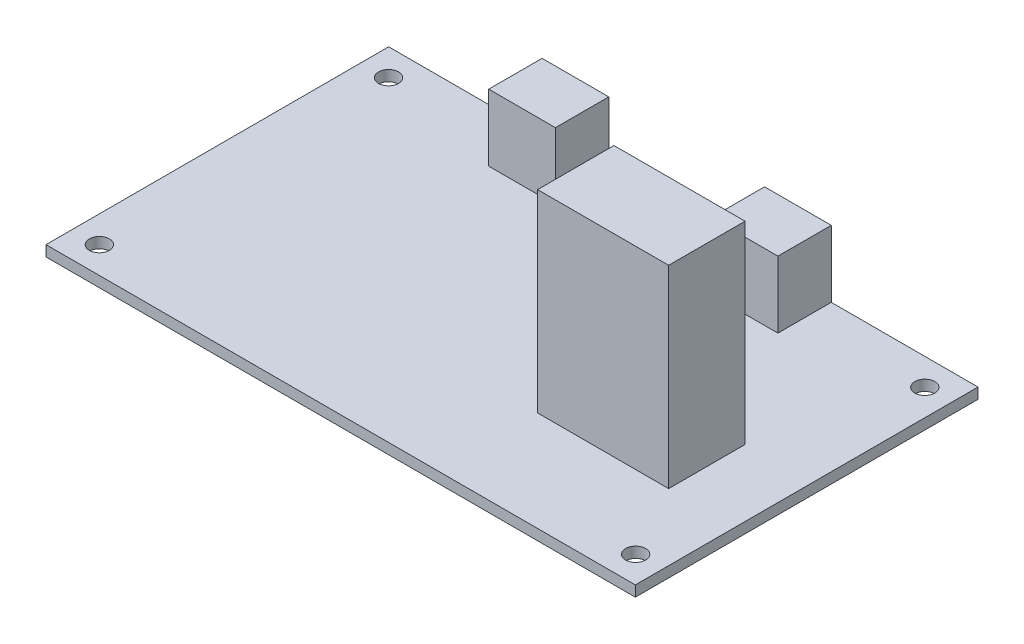
ISO-10303-21;
HEADER;
FILE_DESCRIPTION(('STEP AP214'),'2;1');
FILE_NAME('part.step','',(''),(''),'','','');
FILE_SCHEMA(('AUTOMOTIVE_DESIGN { 1 0 10303 214 1 1 1 1 }'));
ENDSEC;
DATA;
#1=APPLICATION_CONTEXT('core data for automotive mechanical design processes');
#2=APPLICATION_PROTOCOL_DEFINITION('international standard','automotive_design',2000,#1);
#3=PRODUCT_CONTEXT('',#1,'mechanical');
#4=PRODUCT('Part','Part','',(#3));
#5=PRODUCT_RELATED_PRODUCT_CATEGORY('part','',(#4));
#6=PRODUCT_DEFINITION_FORMATION('','',#4);
#7=PRODUCT_DEFINITION_CONTEXT('part definition',#1,'design');
#8=PRODUCT_DEFINITION('design','',#6,#7);
#9=PRODUCT_DEFINITION_SHAPE('','',#8);
#10=(LENGTH_UNIT() NAMED_UNIT(*) SI_UNIT(.MILLI.,.METRE.));
#11=(NAMED_UNIT(*) PLANE_ANGLE_UNIT() SI_UNIT($,.RADIAN.));
#12=(NAMED_UNIT(*) SI_UNIT($,.STERADIAN.) SOLID_ANGLE_UNIT());
#13=UNCERTAINTY_MEASURE_WITH_UNIT(LENGTH_MEASURE(1.E-05),#10,'distance_accuracy_value','');
#14=(GEOMETRIC_REPRESENTATION_CONTEXT(3) GLOBAL_UNCERTAINTY_ASSIGNED_CONTEXT((#13)) GLOBAL_UNIT_ASSIGNED_CONTEXT((#10,
#11,#12)) REPRESENTATION_CONTEXT('',''));
#15=CARTESIAN_POINT('',(0.,0.,0.));
#16=DIRECTION('',(0.,0.,1.));
#17=DIRECTION('',(1.,0.,0.));
#18=AXIS2_PLACEMENT_3D('',#15,#16,#17);
#19=CARTESIAN_POINT('',(0.,1.6,0.));
#20=DIRECTION('',(0.,1.,0.));
#21=DIRECTION('',(0.,0.,1.));
#22=AXIS2_PLACEMENT_3D('',#19,#20,#21);
#23=PLANE('',#22);
#24=CARTESIAN_POINT('',(-27.2380952380953,1.6,-27.5504761904762));
#25=DIRECTION('',(0.,1.,0.));
#26=DIRECTION('',(0.,0.,1.));
#27=AXIS2_PLACEMENT_3D('',#24,#25,#26);
#28=CIRCLE('',#27,1.5);
#29=CARTESIAN_POINT('',(-27.2380952380953,1.6,-26.0504761904762));
#30=VERTEX_POINT('',#29);
#31=EDGE_CURVE('E303',#30,#30,#28,.T.);
#32=ORIENTED_EDGE('',*,*,#31,.F.);
#33=EDGE_LOOP('',(#32));
#34=FACE_BOUND('',#33,.T.);
#35=CARTESIAN_POINT('',(53.1719047619048,1.6,15.8095238095238));
#36=DIRECTION('',(0.,1.,0.));
#37=DIRECTION('',(0.,0.,1.));
#38=AXIS2_PLACEMENT_3D('',#35,#36,#37);
#39=CIRCLE('',#38,1.5);
#40=CARTESIAN_POINT('',(53.1719047619048,1.6,17.3095238095238));
#41=VERTEX_POINT('',#40);
#42=EDGE_CURVE('E315',#41,#41,#39,.T.);
#43=ORIENTED_EDGE('',*,*,#42,.F.);
#44=EDGE_LOOP('',(#43));
#45=FACE_BOUND('',#44,.T.);
#46=CARTESIAN_POINT('',(53.1719047619047,1.6,-27.5504761904762));
#47=DIRECTION('',(0.,1.,0.));
#48=DIRECTION('',(0.,0.,1.));
#49=AXIS2_PLACEMENT_3D('',#46,#47,#48);
#50=CIRCLE('',#49,1.5);
#51=CARTESIAN_POINT('',(53.1719047619047,1.6,-26.0504761904762));
#52=VERTEX_POINT('',#51);
#53=EDGE_CURVE('E309',#52,#52,#50,.T.);
#54=ORIENTED_EDGE('',*,*,#53,.F.);
#55=EDGE_LOOP('',(#54));
#56=FACE_BOUND('',#55,.T.);
#57=CARTESIAN_POINT('',(-27.2380952380952,1.6,15.8095238095238));
#58=DIRECTION('',(0.,1.,0.));
#59=DIRECTION('',(0.,0.,1.));
#60=AXIS2_PLACEMENT_3D('',#57,#58,#59);
#61=CIRCLE('',#60,1.5);
#62=CARTESIAN_POINT('',(-27.2380952380952,1.6,17.3095238095238));
#63=VERTEX_POINT('',#62);
#64=EDGE_CURVE('E297',#63,#63,#61,.T.);
#65=ORIENTED_EDGE('',*,*,#64,.F.);
#66=EDGE_LOOP('',(#65));
#67=FACE_BOUND('',#66,.T.);
#68=DIRECTION('',(1.,0.,0.));
#69=VECTOR('',#68,1.);
#70=CARTESIAN_POINT('',(-31.2380952380952,1.6,-31.5704761904758));
#71=LINE('',#70,#69);
#72=CARTESIAN_POINT('',(1.76190476190482,1.6,-31.5704761904758));
#73=VERTEX_POINT('',#72);
#74=CARTESIAN_POINT('',(25.1219047619048,1.6,-31.5704761904758));
#75=VERTEX_POINT('',#74);
#76=EDGE_CURVE('E333',#73,#75,#71,.T.);
#77=ORIENTED_EDGE('',*,*,#76,.F.);
#78=DIRECTION('',(0.,0.,-1.));
#79=VECTOR('',#78,1.);
#80=CARTESIAN_POINT('',(1.76190476190482,1.6,-31.5704761904758));
#81=LINE('',#80,#79);
#82=CARTESIAN_POINT('',(1.76190476190482,1.6,-23.5704761904758));
#83=VERTEX_POINT('',#82);
#84=EDGE_CURVE('E122',#83,#73,#81,.T.);
#85=ORIENTED_EDGE('',*,*,#84,.F.);
#86=DIRECTION('',(1.,0.,0.));
#87=VECTOR('',#86,1.);
#88=CARTESIAN_POINT('',(1.76190476190482,1.6,-23.5704761904758));
#89=LINE('',#88,#87);
#90=CARTESIAN_POINT('',(-8.23809523809518,1.6,-23.5704761904758));
#91=VERTEX_POINT('',#90);
#92=EDGE_CURVE('E249',#91,#83,#89,.T.);
#93=ORIENTED_EDGE('',*,*,#92,.F.);
#94=DIRECTION('',(0.,0.,1.));
#95=VECTOR('',#94,1.);
#96=CARTESIAN_POINT('',(-8.23809523809518,1.6,-31.5704761904758));
#97=LINE('',#96,#95);
#98=CARTESIAN_POINT('',(-8.23809523809518,1.6,-31.5704761904758));
#99=VERTEX_POINT('',#98);
#100=EDGE_CURVE('E240',#99,#91,#97,.T.);
#101=ORIENTED_EDGE('',*,*,#100,.F.);
#102=CARTESIAN_POINT('',(-31.2380952380952,1.6,-31.5704761904758));
#103=VERTEX_POINT('',#102);
#104=EDGE_CURVE('E329',#103,#99,#71,.T.);
#105=ORIENTED_EDGE('',*,*,#104,.F.);
#106=DIRECTION('',(0.,0.,-1.));
#107=VECTOR('',#106,1.);
#108=CARTESIAN_POINT('',(-31.2380952380952,1.6,19.8095238095238));
#109=LINE('',#108,#107);
#110=CARTESIAN_POINT('',(-31.2380952380952,1.6,19.8095238095238));
#111=VERTEX_POINT('',#110);
#112=EDGE_CURVE('E332',#111,#103,#109,.T.);
#113=ORIENTED_EDGE('',*,*,#112,.F.);
#114=DIRECTION('',(1.,0.,0.));
#115=VECTOR('',#114,1.);
#116=CARTESIAN_POINT('',(-31.2380952380952,1.6,19.8095238095238));
#117=LINE('',#116,#115);
#118=CARTESIAN_POINT('',(57.1219047619048,1.6,19.8095238095238));
#119=VERTEX_POINT('',#118);
#120=EDGE_CURVE('E321',#111,#119,#117,.T.);
#121=ORIENTED_EDGE('',*,*,#120,.T.);
#122=DIRECTION('',(0.,0.,-1.));
#123=VECTOR('',#122,1.);
#124=CARTESIAN_POINT('',(57.1219047619048,1.6,19.8095238095238));
#125=LINE('',#124,#123);
#126=CARTESIAN_POINT('',(57.1219047619048,1.6,-31.5704761904758));
#127=VERTEX_POINT('',#126);
#128=EDGE_CURVE('E324',#119,#127,#125,.T.);
#129=ORIENTED_EDGE('',*,*,#128,.T.);
#130=CARTESIAN_POINT('',(35.1219047619048,1.6,-31.5704761904758));
#131=VERTEX_POINT('',#130);
#132=EDGE_CURVE('E328',#131,#127,#71,.T.);
#133=ORIENTED_EDGE('',*,*,#132,.F.);
#134=DIRECTION('',(0.,0.,-1.));
#135=VECTOR('',#134,1.);
#136=CARTESIAN_POINT('',(35.1219047619048,1.6,-31.5704761904758));
#137=LINE('',#136,#135);
#138=CARTESIAN_POINT('',(35.1219047619048,1.6,-23.5704761904758));
#139=VERTEX_POINT('',#138);
#140=EDGE_CURVE('E266',#139,#131,#137,.T.);
#141=ORIENTED_EDGE('',*,*,#140,.F.);
#142=DIRECTION('',(1.,0.,0.));
#143=VECTOR('',#142,1.);
#144=CARTESIAN_POINT('',(35.1219047619048,1.6,-23.5704761904758));
#145=LINE('',#144,#143);
#146=CARTESIAN_POINT('',(25.1219047619048,1.6,-23.5704761904758));
#147=VERTEX_POINT('',#146);
#148=EDGE_CURVE('E271',#147,#139,#145,.T.);
#149=ORIENTED_EDGE('',*,*,#148,.F.);
#150=DIRECTION('',(0.,0.,1.));
#151=VECTOR('',#150,1.);
#152=CARTESIAN_POINT('',(25.1219047619048,1.6,-31.5704761904758));
#153=LINE('',#152,#151);
#154=EDGE_CURVE('E280',#75,#147,#153,.T.);
#155=ORIENTED_EDGE('',*,*,#154,.F.);
#156=EDGE_LOOP('',(#77,#85,#93,#101,#105,#113,#121,#129,#133,#141,#149,#155));
#157=FACE_BOUND('',#156,.T.);
#158=DIRECTION('',(-1.,0.,0.));
#159=VECTOR('',#158,1.);
#160=CARTESIAN_POINT('',(47.1219047619048,1.6,-6.64163494638696));
#161=LINE('',#160,#159);
#162=CARTESIAN_POINT('',(47.1219047619048,1.6,-6.64163494638696));
#163=VERTEX_POINT('',#162);
#164=CARTESIAN_POINT('',(27.4718200922198,1.6,-6.64163494638695));
#165=VERTEX_POINT('',#164);
#166=EDGE_CURVE('E605',#163,#165,#161,.T.);
#167=ORIENTED_EDGE('',*,*,#166,.F.);
#168=DIRECTION('',(0.,0.,-1.));
#169=VECTOR('',#168,1.);
#170=CARTESIAN_POINT('',(47.1219047619048,1.6,-6.64163494638696));
#171=LINE('',#170,#169);
#172=CARTESIAN_POINT('',(47.1219047619048,1.6,4.80952380952378));
#173=VERTEX_POINT('',#172);
#174=EDGE_CURVE('E237',#173,#163,#171,.T.);
#175=ORIENTED_EDGE('',*,*,#174,.F.);
#176=DIRECTION('',(1.,0.,0.));
#177=VECTOR('',#176,1.);
#178=CARTESIAN_POINT('',(47.1219047619048,1.6,4.80952380952378));
#179=LINE('',#178,#177);
#180=CARTESIAN_POINT('',(27.4718200922198,1.6,4.80952380952378));
#181=VERTEX_POINT('',#180);
#182=EDGE_CURVE('E233',#181,#173,#179,.T.);
#183=ORIENTED_EDGE('',*,*,#182,.F.);
#184=DIRECTION('',(0.,0.,1.));
#185=VECTOR('',#184,1.);
#186=CARTESIAN_POINT('',(27.4718200922198,1.6,-6.64163494638695));
#187=LINE('',#186,#185);
#188=EDGE_CURVE('E602',#165,#181,#187,.T.);
#189=ORIENTED_EDGE('',*,*,#188,.F.);
#190=EDGE_LOOP('',(#167,#175,#183,#189));
#191=FACE_BOUND('',#190,.T.);
#192=ADVANCED_FACE('F99',(#34,#45,#56,#67,#157,#191),#23,.T.);
#193=CARTESIAN_POINT('',(0.,0.,0.));
#194=DIRECTION('',(0.,1.,0.));
#195=DIRECTION('',(0.,0.,1.));
#196=AXIS2_PLACEMENT_3D('',#193,#194,#195);
#197=PLANE('',#196);
#198=DIRECTION('',(1.,0.,0.));
#199=VECTOR('',#198,1.);
#200=CARTESIAN_POINT('',(-31.2380952380952,0.,19.8095238095238));
#201=LINE('',#200,#199);
#202=CARTESIAN_POINT('',(-31.2380952380952,0.,19.8095238095238));
#203=VERTEX_POINT('',#202);
#204=CARTESIAN_POINT('',(57.1219047619048,0.,19.8095238095238));
#205=VERTEX_POINT('',#204);
#206=EDGE_CURVE('E318',#203,#205,#201,.T.);
#207=ORIENTED_EDGE('',*,*,#206,.F.);
#208=DIRECTION('',(0.,0.,-1.));
#209=VECTOR('',#208,1.);
#210=CARTESIAN_POINT('',(-31.2380952380952,0.,19.8095238095238));
#211=LINE('',#210,#209);
#212=CARTESIAN_POINT('',(-31.2380952380952,0.,-31.5704761904758));
#213=VERTEX_POINT('',#212);
#214=EDGE_CURVE('E325',#203,#213,#211,.T.);
#215=ORIENTED_EDGE('',*,*,#214,.T.);
#216=DIRECTION('',(1.,0.,0.));
#217=VECTOR('',#216,1.);
#218=CARTESIAN_POINT('',(-31.2380952380952,0.,-31.5704761904758));
#219=LINE('',#218,#217);
#220=CARTESIAN_POINT('',(57.1219047619048,0.,-31.5704761904758));
#221=VERTEX_POINT('',#220);
#222=EDGE_CURVE('E342',#213,#221,#219,.T.);
#223=ORIENTED_EDGE('',*,*,#222,.T.);
#224=DIRECTION('',(0.,0.,-1.));
#225=VECTOR('',#224,1.);
#226=CARTESIAN_POINT('',(57.1219047619048,0.,19.8095238095238));
#227=LINE('',#226,#225);
#228=EDGE_CURVE('E339',#205,#221,#227,.T.);
#229=ORIENTED_EDGE('',*,*,#228,.F.);
#230=EDGE_LOOP('',(#207,#215,#223,#229));
#231=FACE_BOUND('',#230,.T.);
#232=CARTESIAN_POINT('',(53.1719047619048,0.,15.8095238095238));
#233=DIRECTION('',(0.,1.,0.));
#234=DIRECTION('',(0.,0.,1.));
#235=AXIS2_PLACEMENT_3D('',#232,#233,#234);
#236=CIRCLE('',#235,1.5);
#237=CARTESIAN_POINT('',(53.1719047619048,0.,17.3095238095238));
#238=VERTEX_POINT('',#237);
#239=EDGE_CURVE('E312',#238,#238,#236,.T.);
#240=ORIENTED_EDGE('',*,*,#239,.T.);
#241=EDGE_LOOP('',(#240));
#242=FACE_BOUND('',#241,.T.);
#243=CARTESIAN_POINT('',(53.1719047619047,0.,-27.5504761904762));
#244=DIRECTION('',(0.,1.,0.));
#245=DIRECTION('',(0.,0.,1.));
#246=AXIS2_PLACEMENT_3D('',#243,#244,#245);
#247=CIRCLE('',#246,1.5);
#248=CARTESIAN_POINT('',(53.1719047619047,0.,-26.0504761904762));
#249=VERTEX_POINT('',#248);
#250=EDGE_CURVE('E306',#249,#249,#247,.T.);
#251=ORIENTED_EDGE('',*,*,#250,.T.);
#252=EDGE_LOOP('',(#251));
#253=FACE_BOUND('',#252,.T.);
#254=CARTESIAN_POINT('',(-27.2380952380953,0.,-27.5504761904762));
#255=DIRECTION('',(0.,1.,0.));
#256=DIRECTION('',(0.,0.,1.));
#257=AXIS2_PLACEMENT_3D('',#254,#255,#256);
#258=CIRCLE('',#257,1.5);
#259=CARTESIAN_POINT('',(-27.2380952380953,0.,-26.0504761904762));
#260=VERTEX_POINT('',#259);
#261=EDGE_CURVE('E300',#260,#260,#258,.T.);
#262=ORIENTED_EDGE('',*,*,#261,.T.);
#263=EDGE_LOOP('',(#262));
#264=FACE_BOUND('',#263,.T.);
#265=CARTESIAN_POINT('',(-27.2380952380952,0.,15.8095238095238));
#266=DIRECTION('',(0.,1.,0.));
#267=DIRECTION('',(0.,0.,1.));
#268=AXIS2_PLACEMENT_3D('',#265,#266,#267);
#269=CIRCLE('',#268,1.5);
#270=CARTESIAN_POINT('',(-27.2380952380952,0.,17.3095238095238));
#271=VERTEX_POINT('',#270);
#272=EDGE_CURVE('E296',#271,#271,#269,.T.);
#273=ORIENTED_EDGE('',*,*,#272,.T.);
#274=EDGE_LOOP('',(#273));
#275=FACE_BOUND('',#274,.T.);
#276=ADVANCED_FACE('F358',(#231,#242,#253,#264,#275),#197,.F.);
#277=CARTESIAN_POINT('',(-31.2380952380952,1.6,19.8095238095238));
#278=DIRECTION('',(0.,0.,-1.));
#279=DIRECTION('',(-1.,0.,0.));
#280=AXIS2_PLACEMENT_3D('',#277,#278,#279);
#281=PLANE('',#280);
#282=ORIENTED_EDGE('',*,*,#206,.T.);
#283=DIRECTION('',(0.,-1.,0.));
#284=VECTOR('',#283,1.);
#285=CARTESIAN_POINT('',(57.1219047619048,1.6,19.8095238095238));
#286=LINE('',#285,#284);
#287=EDGE_CURVE('E12',#119,#205,#286,.T.);
#288=ORIENTED_EDGE('',*,*,#287,.F.);
#289=ORIENTED_EDGE('',*,*,#120,.F.);
#290=DIRECTION('',(0.,-1.,0.));
#291=VECTOR('',#290,1.);
#292=CARTESIAN_POINT('',(-31.2380952380952,1.6,19.8095238095238));
#293=LINE('',#292,#291);
#294=EDGE_CURVE('E336',#111,#203,#293,.T.);
#295=ORIENTED_EDGE('',*,*,#294,.T.);
#296=EDGE_LOOP('',(#282,#288,#289,#295));
#297=FACE_BOUND('',#296,.T.);
#298=ADVANCED_FACE('F101',(#297),#281,.F.);
#299=CARTESIAN_POINT('',(57.1219047619048,1.6,19.8095238095238));
#300=DIRECTION('',(-1.,0.,0.));
#301=DIRECTION('',(0.,0.,1.));
#302=AXIS2_PLACEMENT_3D('',#299,#300,#301);
#303=PLANE('',#302);
#304=ORIENTED_EDGE('',*,*,#228,.T.);
#305=DIRECTION('',(0.,-1.,0.));
#306=VECTOR('',#305,1.);
#307=CARTESIAN_POINT('',(57.1219047619048,1.6,-31.5704761904758));
#308=LINE('',#307,#306);
#309=EDGE_CURVE('E107',#127,#221,#308,.T.);
#310=ORIENTED_EDGE('',*,*,#309,.F.);
#311=ORIENTED_EDGE('',*,*,#128,.F.);
#312=ORIENTED_EDGE('',*,*,#287,.T.);
#313=EDGE_LOOP('',(#304,#310,#311,#312));
#314=FACE_BOUND('',#313,.T.);
#315=ADVANCED_FACE('F354',(#314),#303,.F.);
#316=CARTESIAN_POINT('',(-31.2380952380952,1.6,-31.5704761904758));
#317=DIRECTION('',(0.,0.,-1.));
#318=DIRECTION('',(-1.,0.,0.));
#319=AXIS2_PLACEMENT_3D('',#316,#317,#318);
#320=PLANE('',#319);
#321=ORIENTED_EDGE('',*,*,#222,.F.);
#322=DIRECTION('',(0.,-1.,0.));
#323=VECTOR('',#322,1.);
#324=CARTESIAN_POINT('',(-31.2380952380952,1.6,-31.5704761904758));
#325=LINE('',#324,#323);
#326=EDGE_CURVE('E348',#103,#213,#325,.T.);
#327=ORIENTED_EDGE('',*,*,#326,.F.);
#328=ORIENTED_EDGE('',*,*,#104,.T.);
#329=DIRECTION('',(0.,-1.,0.));
#330=VECTOR('',#329,1.);
#331=CARTESIAN_POINT('',(-8.23809523809518,11.6,-31.5704761904758));
#332=LINE('',#331,#330);
#333=CARTESIAN_POINT('',(-8.23809523809518,11.6,-31.5704761904758));
#334=VERTEX_POINT('',#333);
#335=EDGE_CURVE('E262',#334,#99,#332,.T.);
#336=ORIENTED_EDGE('',*,*,#335,.F.);
#337=DIRECTION('',(-1.,0.,0.));
#338=VECTOR('',#337,1.);
#339=CARTESIAN_POINT('',(1.76190476190482,11.6,-31.5704761904758));
#340=LINE('',#339,#338);
#341=CARTESIAN_POINT('',(1.76190476190482,11.6,-31.5704761904758));
#342=VERTEX_POINT('',#341);
#343=EDGE_CURVE('E248',#342,#334,#340,.T.);
#344=ORIENTED_EDGE('',*,*,#343,.F.);
#345=DIRECTION('',(0.,-1.,0.));
#346=VECTOR('',#345,1.);
#347=CARTESIAN_POINT('',(1.76190476190482,11.6,-31.5704761904758));
#348=LINE('',#347,#346);
#349=EDGE_CURVE('E264',#342,#73,#348,.T.);
#350=ORIENTED_EDGE('',*,*,#349,.T.);
#351=ORIENTED_EDGE('',*,*,#76,.T.);
#352=DIRECTION('',(0.,-1.,0.));
#353=VECTOR('',#352,1.);
#354=CARTESIAN_POINT('',(25.1219047619048,11.6,-31.5704761904758));
#355=LINE('',#354,#353);
#356=CARTESIAN_POINT('',(25.1219047619048,11.6,-31.5704761904758));
#357=VERTEX_POINT('',#356);
#358=EDGE_CURVE('E290',#357,#75,#355,.T.);
#359=ORIENTED_EDGE('',*,*,#358,.F.);
#360=DIRECTION('',(-1.,0.,0.));
#361=VECTOR('',#360,1.);
#362=CARTESIAN_POINT('',(35.1219047619048,11.6,-31.5704761904758));
#363=LINE('',#362,#361);
#364=CARTESIAN_POINT('',(35.1219047619048,11.6,-31.5704761904758));
#365=VERTEX_POINT('',#364);
#366=EDGE_CURVE('E270',#365,#357,#363,.T.);
#367=ORIENTED_EDGE('',*,*,#366,.F.);
#368=DIRECTION('',(0.,-1.,0.));
#369=VECTOR('',#368,1.);
#370=CARTESIAN_POINT('',(35.1219047619048,11.6,-31.5704761904758));
#371=LINE('',#370,#369);
#372=EDGE_CURVE('E293',#365,#131,#371,.T.);
#373=ORIENTED_EDGE('',*,*,#372,.T.);
#374=ORIENTED_EDGE('',*,*,#132,.T.);
#375=ORIENTED_EDGE('',*,*,#309,.T.);
#376=EDGE_LOOP('',(#321,#327,#328,#336,#344,#350,#351,#359,#367,#373,#374,#375));
#377=FACE_BOUND('',#376,.T.);
#378=ADVANCED_FACE('F352',(#377),#320,.T.);
#379=CARTESIAN_POINT('',(-31.2380952380952,1.6,19.8095238095238));
#380=DIRECTION('',(-1.,0.,0.));
#381=DIRECTION('',(0.,0.,1.));
#382=AXIS2_PLACEMENT_3D('',#379,#380,#381);
#383=PLANE('',#382);
#384=ORIENTED_EDGE('',*,*,#214,.F.);
#385=ORIENTED_EDGE('',*,*,#294,.F.);
#386=ORIENTED_EDGE('',*,*,#112,.T.);
#387=ORIENTED_EDGE('',*,*,#326,.T.);
#388=EDGE_LOOP('',(#384,#385,#386,#387));
#389=FACE_BOUND('',#388,.T.);
#390=ADVANCED_FACE('F362',(#389),#383,.T.);
#391=CARTESIAN_POINT('',(53.1719047619048,1.6,15.8095238095238));
#392=DIRECTION('',(0.,-1.,0.));
#393=DIRECTION('',(0.,0.,-1.));
#394=AXIS2_PLACEMENT_3D('',#391,#392,#393);
#395=CYLINDRICAL_SURFACE('',#394,1.5);
#396=ORIENTED_EDGE('',*,*,#42,.T.);
#397=EDGE_LOOP('',(#396));
#398=FACE_BOUND('',#397,.T.);
#399=ORIENTED_EDGE('',*,*,#239,.F.);
#400=EDGE_LOOP('',(#399));
#401=FACE_BOUND('',#400,.T.);
#402=ADVANCED_FACE('F420',(#398,#401),#395,.F.);
#403=CARTESIAN_POINT('',(53.1719047619047,1.6,-27.5504761904762));
#404=DIRECTION('',(0.,-1.,0.));
#405=DIRECTION('',(0.,0.,-1.));
#406=AXIS2_PLACEMENT_3D('',#403,#404,#405);
#407=CYLINDRICAL_SURFACE('',#406,1.5);
#408=ORIENTED_EDGE('',*,*,#53,.T.);
#409=EDGE_LOOP('',(#408));
#410=FACE_BOUND('',#409,.T.);
#411=ORIENTED_EDGE('',*,*,#250,.F.);
#412=EDGE_LOOP('',(#411));
#413=FACE_BOUND('',#412,.T.);
#414=ADVANCED_FACE('F466',(#410,#413),#407,.F.);
#415=CARTESIAN_POINT('',(-27.2380952380953,1.6,-27.5504761904762));
#416=DIRECTION('',(0.,-1.,0.));
#417=DIRECTION('',(0.,0.,-1.));
#418=AXIS2_PLACEMENT_3D('',#415,#416,#417);
#419=CYLINDRICAL_SURFACE('',#418,1.5);
#420=ORIENTED_EDGE('',*,*,#31,.T.);
#421=EDGE_LOOP('',(#420));
#422=FACE_BOUND('',#421,.T.);
#423=ORIENTED_EDGE('',*,*,#261,.F.);
#424=EDGE_LOOP('',(#423));
#425=FACE_BOUND('',#424,.T.);
#426=ADVANCED_FACE('F474',(#422,#425),#419,.F.);
#427=CARTESIAN_POINT('',(-27.2380952380952,1.6,15.8095238095238));
#428=DIRECTION('',(0.,-1.,0.));
#429=DIRECTION('',(0.,0.,-1.));
#430=AXIS2_PLACEMENT_3D('',#427,#428,#429);
#431=CYLINDRICAL_SURFACE('',#430,1.5);
#432=ORIENTED_EDGE('',*,*,#64,.T.);
#433=EDGE_LOOP('',(#432));
#434=FACE_BOUND('',#433,.T.);
#435=ORIENTED_EDGE('',*,*,#272,.F.);
#436=EDGE_LOOP('',(#435));
#437=FACE_BOUND('',#436,.T.);
#438=ADVANCED_FACE('F481',(#434,#437),#431,.F.);
#439=CARTESIAN_POINT('',(35.1219047619048,11.6,-31.5704761904758));
#440=DIRECTION('',(-1.,0.,0.));
#441=DIRECTION('',(0.,0.,1.));
#442=AXIS2_PLACEMENT_3D('',#439,#440,#441);
#443=PLANE('',#442);
#444=ORIENTED_EDGE('',*,*,#140,.T.);
#445=ORIENTED_EDGE('',*,*,#372,.F.);
#446=DIRECTION('',(0.,0.,-1.));
#447=VECTOR('',#446,1.);
#448=CARTESIAN_POINT('',(35.1219047619048,11.6,-31.5704761904758));
#449=LINE('',#448,#447);
#450=CARTESIAN_POINT('',(35.1219047619048,11.6,-23.5704761904758));
#451=VERTEX_POINT('',#450);
#452=EDGE_CURVE('E267',#451,#365,#449,.T.);
#453=ORIENTED_EDGE('',*,*,#452,.F.);
#454=DIRECTION('',(0.,-1.,0.));
#455=VECTOR('',#454,1.);
#456=CARTESIAN_POINT('',(35.1219047619048,11.6,-23.5704761904758));
#457=LINE('',#456,#455);
#458=EDGE_CURVE('E277',#451,#139,#457,.T.);
#459=ORIENTED_EDGE('',*,*,#458,.T.);
#460=EDGE_LOOP('',(#444,#445,#453,#459));
#461=FACE_BOUND('',#460,.T.);
#462=ADVANCED_FACE('F396',(#461),#443,.F.);
#463=CARTESIAN_POINT('',(25.1219047619048,11.6,-31.5704761904758));
#464=DIRECTION('',(1.,0.,0.));
#465=DIRECTION('',(0.,0.,-1.));
#466=AXIS2_PLACEMENT_3D('',#463,#464,#465);
#467=PLANE('',#466);
#468=ORIENTED_EDGE('',*,*,#154,.T.);
#469=DIRECTION('',(0.,-1.,0.));
#470=VECTOR('',#469,1.);
#471=CARTESIAN_POINT('',(25.1219047619048,11.6,-23.5704761904758));
#472=LINE('',#471,#470);
#473=CARTESIAN_POINT('',(25.1219047619048,11.6,-23.5704761904758));
#474=VERTEX_POINT('',#473);
#475=EDGE_CURVE('E287',#474,#147,#472,.T.);
#476=ORIENTED_EDGE('',*,*,#475,.F.);
#477=DIRECTION('',(0.,0.,1.));
#478=VECTOR('',#477,1.);
#479=CARTESIAN_POINT('',(25.1219047619048,11.6,-31.5704761904758));
#480=LINE('',#479,#478);
#481=EDGE_CURVE('E273',#357,#474,#480,.T.);
#482=ORIENTED_EDGE('',*,*,#481,.F.);
#483=ORIENTED_EDGE('',*,*,#358,.T.);
#484=EDGE_LOOP('',(#468,#476,#482,#483));
#485=FACE_BOUND('',#484,.T.);
#486=ADVANCED_FACE('F388',(#485),#467,.F.);
#487=CARTESIAN_POINT('',(35.1219047619048,11.6,-23.5704761904758));
#488=DIRECTION('',(0.,0.,-1.));
#489=DIRECTION('',(-1.,0.,0.));
#490=AXIS2_PLACEMENT_3D('',#487,#488,#489);
#491=PLANE('',#490);
#492=ORIENTED_EDGE('',*,*,#148,.T.);
#493=ORIENTED_EDGE('',*,*,#458,.F.);
#494=DIRECTION('',(1.,0.,0.));
#495=VECTOR('',#494,1.);
#496=CARTESIAN_POINT('',(35.1219047619048,11.6,-23.5704761904758));
#497=LINE('',#496,#495);
#498=EDGE_CURVE('E275',#474,#451,#497,.T.);
#499=ORIENTED_EDGE('',*,*,#498,.F.);
#500=ORIENTED_EDGE('',*,*,#475,.T.);
#501=EDGE_LOOP('',(#492,#493,#499,#500));
#502=FACE_BOUND('',#501,.T.);
#503=ADVANCED_FACE('F398',(#502),#491,.F.);
#504=CARTESIAN_POINT('',(0.,11.6,0.));
#505=DIRECTION('',(0.,-1.,0.));
#506=DIRECTION('',(0.,0.,-1.));
#507=AXIS2_PLACEMENT_3D('',#504,#505,#506);
#508=PLANE('',#507);
#509=ORIENTED_EDGE('',*,*,#452,.T.);
#510=ORIENTED_EDGE('',*,*,#366,.T.);
#511=ORIENTED_EDGE('',*,*,#481,.T.);
#512=ORIENTED_EDGE('',*,*,#498,.T.);
#513=EDGE_LOOP('',(#509,#510,#511,#512));
#514=FACE_BOUND('',#513,.T.);
#515=ADVANCED_FACE('F392',(#514),#508,.F.);
#516=CARTESIAN_POINT('',(1.76190476190482,11.6,-31.5704761904758));
#517=DIRECTION('',(-1.,0.,0.));
#518=DIRECTION('',(0.,0.,1.));
#519=AXIS2_PLACEMENT_3D('',#516,#517,#518);
#520=PLANE('',#519);
#521=ORIENTED_EDGE('',*,*,#84,.T.);
#522=ORIENTED_EDGE('',*,*,#349,.F.);
#523=DIRECTION('',(0.,0.,-1.));
#524=VECTOR('',#523,1.);
#525=CARTESIAN_POINT('',(1.76190476190482,11.6,-31.5704761904758));
#526=LINE('',#525,#524);
#527=CARTESIAN_POINT('',(1.76190476190482,11.6,-23.5704761904758));
#528=VERTEX_POINT('',#527);
#529=EDGE_CURVE('E245',#528,#342,#526,.T.);
#530=ORIENTED_EDGE('',*,*,#529,.F.);
#531=DIRECTION('',(0.,-1.,0.));
#532=VECTOR('',#531,1.);
#533=CARTESIAN_POINT('',(1.76190476190482,11.6,-23.5704761904758));
#534=LINE('',#533,#532);
#535=EDGE_CURVE('E254',#528,#83,#534,.T.);
#536=ORIENTED_EDGE('',*,*,#535,.T.);
#537=EDGE_LOOP('',(#521,#522,#530,#536));
#538=FACE_BOUND('',#537,.T.);
#539=ADVANCED_FACE('F405',(#538),#520,.F.);
#540=CARTESIAN_POINT('',(-8.23809523809518,11.6,-31.5704761904758));
#541=DIRECTION('',(1.,0.,0.));
#542=DIRECTION('',(0.,0.,-1.));
#543=AXIS2_PLACEMENT_3D('',#540,#541,#542);
#544=PLANE('',#543);
#545=ORIENTED_EDGE('',*,*,#100,.T.);
#546=DIRECTION('',(0.,-1.,0.));
#547=VECTOR('',#546,1.);
#548=CARTESIAN_POINT('',(-8.23809523809518,11.6,-23.5704761904758));
#549=LINE('',#548,#547);
#550=CARTESIAN_POINT('',(-8.23809523809518,11.6,-23.5704761904758));
#551=VERTEX_POINT('',#550);
#552=EDGE_CURVE('E259',#551,#91,#549,.T.);
#553=ORIENTED_EDGE('',*,*,#552,.F.);
#554=DIRECTION('',(0.,0.,1.));
#555=VECTOR('',#554,1.);
#556=CARTESIAN_POINT('',(-8.23809523809518,11.6,-31.5704761904758));
#557=LINE('',#556,#555);
#558=EDGE_CURVE('E251',#334,#551,#557,.T.);
#559=ORIENTED_EDGE('',*,*,#558,.F.);
#560=ORIENTED_EDGE('',*,*,#335,.T.);
#561=EDGE_LOOP('',(#545,#553,#559,#560));
#562=FACE_BOUND('',#561,.T.);
#563=ADVANCED_FACE('F374',(#562),#544,.F.);
#564=CARTESIAN_POINT('',(1.76190476190482,11.6,-23.5704761904758));
#565=DIRECTION('',(0.,0.,-1.));
#566=DIRECTION('',(-1.,0.,0.));
#567=AXIS2_PLACEMENT_3D('',#564,#565,#566);
#568=PLANE('',#567);
#569=ORIENTED_EDGE('',*,*,#92,.T.);
#570=ORIENTED_EDGE('',*,*,#535,.F.);
#571=DIRECTION('',(1.,0.,0.));
#572=VECTOR('',#571,1.);
#573=CARTESIAN_POINT('',(1.76190476190482,11.6,-23.5704761904758));
#574=LINE('',#573,#572);
#575=EDGE_CURVE('E253',#551,#528,#574,.T.);
#576=ORIENTED_EDGE('',*,*,#575,.F.);
#577=ORIENTED_EDGE('',*,*,#552,.T.);
#578=EDGE_LOOP('',(#569,#570,#576,#577));
#579=FACE_BOUND('',#578,.T.);
#580=ADVANCED_FACE('F378',(#579),#568,.F.);
#581=CARTESIAN_POINT('',(0.,11.6,0.));
#582=DIRECTION('',(0.,-1.,0.));
#583=DIRECTION('',(0.,0.,-1.));
#584=AXIS2_PLACEMENT_3D('',#581,#582,#583);
#585=PLANE('',#584);
#586=ORIENTED_EDGE('',*,*,#529,.T.);
#587=ORIENTED_EDGE('',*,*,#343,.T.);
#588=ORIENTED_EDGE('',*,*,#558,.T.);
#589=ORIENTED_EDGE('',*,*,#575,.T.);
#590=EDGE_LOOP('',(#586,#587,#588,#589));
#591=FACE_BOUND('',#590,.T.);
#592=ADVANCED_FACE('F382',(#591),#585,.F.);
#593=CARTESIAN_POINT('',(47.1219047619048,30.6,-6.64163494638696));
#594=DIRECTION('',(-1.,0.,0.));
#595=DIRECTION('',(0.,0.,1.));
#596=AXIS2_PLACEMENT_3D('',#593,#594,#595);
#597=PLANE('',#596);
#598=ORIENTED_EDGE('',*,*,#174,.T.);
#599=DIRECTION('',(0.,-1.,0.));
#600=VECTOR('',#599,1.);
#601=CARTESIAN_POINT('',(47.1219047619048,30.6,-6.64163494638696));
#602=LINE('',#601,#600);
#603=CARTESIAN_POINT('',(47.1219047619048,30.6,-6.64163494638696));
#604=VERTEX_POINT('',#603);
#605=EDGE_CURVE('E218',#604,#163,#602,.T.);
#606=ORIENTED_EDGE('',*,*,#605,.F.);
#607=DIRECTION('',(0.,0.,-1.));
#608=VECTOR('',#607,1.);
#609=CARTESIAN_POINT('',(47.1219047619048,30.6,-6.64163494638696));
#610=LINE('',#609,#608);
#611=CARTESIAN_POINT('',(47.1219047619048,30.6,4.80952380952378));
#612=VERTEX_POINT('',#611);
#613=EDGE_CURVE('E225',#612,#604,#610,.T.);
#614=ORIENTED_EDGE('',*,*,#613,.F.);
#615=DIRECTION('',(0.,-1.,0.));
#616=VECTOR('',#615,1.);
#617=CARTESIAN_POINT('',(47.1219047619048,30.6,4.80952380952378));
#618=LINE('',#617,#616);
#619=EDGE_CURVE('E600',#612,#173,#618,.T.);
#620=ORIENTED_EDGE('',*,*,#619,.T.);
#621=EDGE_LOOP('',(#598,#606,#614,#620));
#622=FACE_BOUND('',#621,.T.);
#623=ADVANCED_FACE('F235',(#622),#597,.F.);
#624=CARTESIAN_POINT('',(47.1219047619048,30.6,-6.64163494638696));
#625=DIRECTION('',(0.,0.,1.));
#626=DIRECTION('',(1.,0.,0.));
#627=AXIS2_PLACEMENT_3D('',#624,#625,#626);
#628=PLANE('',#627);
#629=ORIENTED_EDGE('',*,*,#166,.T.);
#630=DIRECTION('',(0.,-1.,0.));
#631=VECTOR('',#630,1.);
#632=CARTESIAN_POINT('',(27.4718200922198,30.6,-6.64163494638695));
#633=LINE('',#632,#631);
#634=CARTESIAN_POINT('',(27.4718200922198,30.6,-6.64163494638695));
#635=VERTEX_POINT('',#634);
#636=EDGE_CURVE('E221',#635,#165,#633,.T.);
#637=ORIENTED_EDGE('',*,*,#636,.F.);
#638=DIRECTION('',(-1.,0.,0.));
#639=VECTOR('',#638,1.);
#640=CARTESIAN_POINT('',(47.1219047619048,30.6,-6.64163494638696));
#641=LINE('',#640,#639);
#642=EDGE_CURVE('E214',#604,#635,#641,.T.);
#643=ORIENTED_EDGE('',*,*,#642,.F.);
#644=ORIENTED_EDGE('',*,*,#605,.T.);
#645=EDGE_LOOP('',(#629,#637,#643,#644));
#646=FACE_BOUND('',#645,.T.);
#647=ADVANCED_FACE('F216',(#646),#628,.F.);
#648=CARTESIAN_POINT('',(27.4718200922198,30.6,-6.64163494638695));
#649=DIRECTION('',(1.,0.,0.));
#650=DIRECTION('',(0.,0.,-1.));
#651=AXIS2_PLACEMENT_3D('',#648,#649,#650);
#652=PLANE('',#651);
#653=ORIENTED_EDGE('',*,*,#188,.T.);
#654=DIRECTION('',(0.,-1.,0.));
#655=VECTOR('',#654,1.);
#656=CARTESIAN_POINT('',(27.4718200922198,30.6,4.80952380952378));
#657=LINE('',#656,#655);
#658=CARTESIAN_POINT('',(27.4718200922198,30.6,4.80952380952378));
#659=VERTEX_POINT('',#658);
#660=EDGE_CURVE('E114',#659,#181,#657,.T.);
#661=ORIENTED_EDGE('',*,*,#660,.F.);
#662=DIRECTION('',(0.,0.,1.));
#663=VECTOR('',#662,1.);
#664=CARTESIAN_POINT('',(27.4718200922198,30.6,-6.64163494638695));
#665=LINE('',#664,#663);
#666=EDGE_CURVE('E224',#635,#659,#665,.T.);
#667=ORIENTED_EDGE('',*,*,#666,.F.);
#668=ORIENTED_EDGE('',*,*,#636,.T.);
#669=EDGE_LOOP('',(#653,#661,#667,#668));
#670=FACE_BOUND('',#669,.T.);
#671=ADVANCED_FACE('F566',(#670),#652,.F.);
#672=CARTESIAN_POINT('',(47.1219047619048,30.6,4.80952380952378));
#673=DIRECTION('',(0.,0.,-1.));
#674=DIRECTION('',(-1.,0.,0.));
#675=AXIS2_PLACEMENT_3D('',#672,#673,#674);
#676=PLANE('',#675);
#677=ORIENTED_EDGE('',*,*,#182,.T.);
#678=ORIENTED_EDGE('',*,*,#619,.F.);
#679=DIRECTION('',(1.,0.,0.));
#680=VECTOR('',#679,1.);
#681=CARTESIAN_POINT('',(47.1219047619048,30.6,4.80952380952378));
#682=LINE('',#681,#680);
#683=EDGE_CURVE('E229',#659,#612,#682,.T.);
#684=ORIENTED_EDGE('',*,*,#683,.F.);
#685=ORIENTED_EDGE('',*,*,#660,.T.);
#686=EDGE_LOOP('',(#677,#678,#684,#685));
#687=FACE_BOUND('',#686,.T.);
#688=ADVANCED_FACE('F573',(#687),#676,.F.);
#689=CARTESIAN_POINT('',(0.,30.6,0.));
#690=DIRECTION('',(0.,-1.,0.));
#691=DIRECTION('',(0.,0.,-1.));
#692=AXIS2_PLACEMENT_3D('',#689,#690,#691);
#693=PLANE('',#692);
#694=ORIENTED_EDGE('',*,*,#613,.T.);
#695=ORIENTED_EDGE('',*,*,#642,.T.);
#696=ORIENTED_EDGE('',*,*,#666,.T.);
#697=ORIENTED_EDGE('',*,*,#683,.T.);
#698=EDGE_LOOP('',(#694,#695,#696,#697));
#699=FACE_BOUND('',#698,.T.);
#700=ADVANCED_FACE('F228',(#699),#693,.F.);
#701=CLOSED_SHELL('',(#192,#276,#298,#315,#378,#390,#402,#414,#426,#438,#462,#486,#503,#515,
#539,#563,#580,#592,#623,#647,#671,#688,#700));
#702=MANIFOLD_SOLID_BREP('B2',#701);
#703=ADVANCED_BREP_SHAPE_REPRESENTATION('',(#18,#702),#14);
#704=SHAPE_DEFINITION_REPRESENTATION(#9,#703);
ENDSEC;
END-ISO-10303-21;
